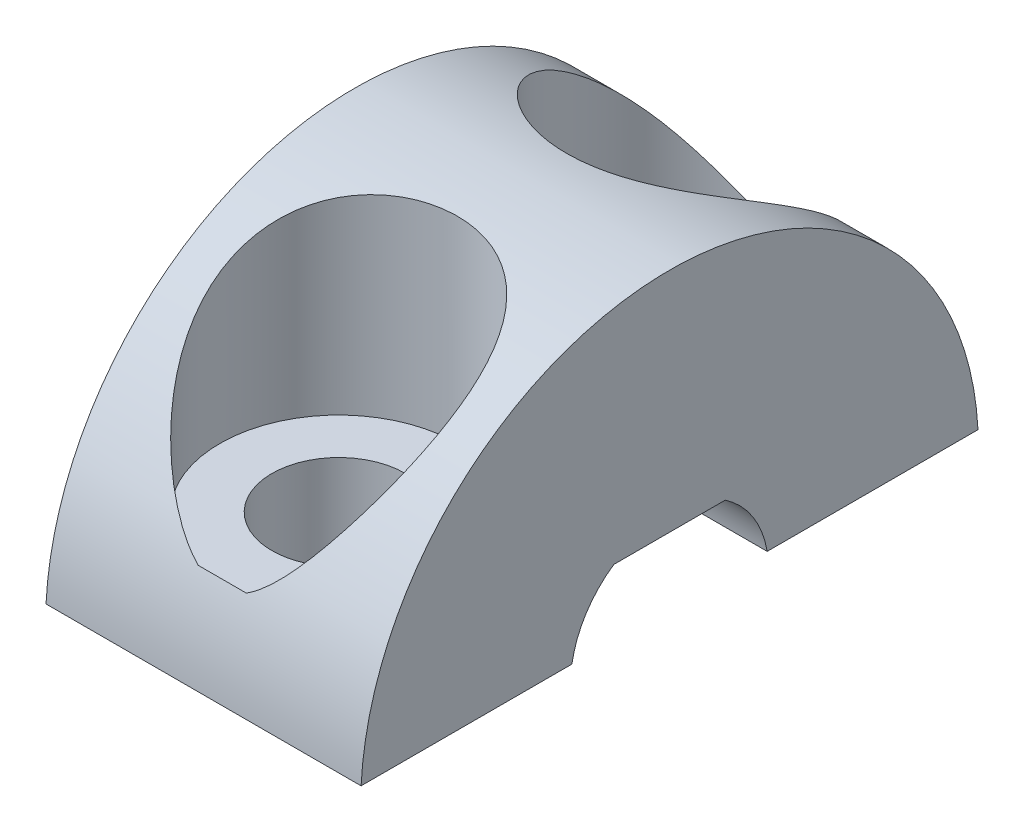
ISO-10303-21;
HEADER;
FILE_DESCRIPTION(('STEP AP214'),'2;1');
FILE_NAME('part.step','',(''),(''),'','','');
FILE_SCHEMA(('AUTOMOTIVE_DESIGN { 1 0 10303 214 1 1 1 1 }'));
ENDSEC;
DATA;
#1=APPLICATION_CONTEXT('core data for automotive mechanical design processes');
#2=APPLICATION_PROTOCOL_DEFINITION('international standard','automotive_design',2000,#1);
#3=PRODUCT_CONTEXT('',#1,'mechanical');
#4=PRODUCT('Part','Part','',(#3));
#5=PRODUCT_RELATED_PRODUCT_CATEGORY('part','',(#4));
#6=PRODUCT_DEFINITION_FORMATION('','',#4);
#7=PRODUCT_DEFINITION_CONTEXT('part definition',#1,'design');
#8=PRODUCT_DEFINITION('design','',#6,#7);
#9=PRODUCT_DEFINITION_SHAPE('','',#8);
#10=(LENGTH_UNIT() NAMED_UNIT(*) SI_UNIT(.MILLI.,.METRE.));
#11=(NAMED_UNIT(*) PLANE_ANGLE_UNIT() SI_UNIT($,.RADIAN.));
#12=(NAMED_UNIT(*) SI_UNIT($,.STERADIAN.) SOLID_ANGLE_UNIT());
#13=UNCERTAINTY_MEASURE_WITH_UNIT(LENGTH_MEASURE(1.E-05),#10,'distance_accuracy_value','');
#14=(GEOMETRIC_REPRESENTATION_CONTEXT(3) GLOBAL_UNCERTAINTY_ASSIGNED_CONTEXT((#13)) GLOBAL_UNIT_ASSIGNED_CONTEXT((#10,
#11,#12)) REPRESENTATION_CONTEXT('',''));
#15=CARTESIAN_POINT('',(0.,0.,0.));
#16=DIRECTION('',(0.,0.,1.));
#17=DIRECTION('',(1.,0.,0.));
#18=AXIS2_PLACEMENT_3D('',#15,#16,#17);
#19=CARTESIAN_POINT('',(-4.608292147038,9.363068992456,-5.25));
#20=DIRECTION('',(0.,-1.,0.));
#21=DIRECTION('',(0.,0.,-1.));
#22=AXIS2_PLACEMENT_3D('',#19,#20,#21);
#23=CYLINDRICAL_SURFACE('',#22,2.025);
#24=CARTESIAN_POINT('',(-4.608292147038,0.5,-5.25));
#25=DIRECTION('',(0.,-1.,0.));
#26=DIRECTION('',(0.,0.,-1.));
#27=AXIS2_PLACEMENT_3D('',#24,#25,#26);
#28=CIRCLE('',#27,2.025);
#29=CARTESIAN_POINT('',(-4.608292147038,0.5,-7.275));
#30=VERTEX_POINT('',#29);
#31=EDGE_CURVE('E102',#30,#30,#28,.T.);
#32=ORIENTED_EDGE('',*,*,#31,.T.);
#33=EDGE_LOOP('',(#32));
#34=FACE_BOUND('',#33,.T.);
#35=CARTESIAN_POINT('',(-4.608292147038,3.25,-5.25));
#36=DIRECTION('',(0.,-1.,0.));
#37=DIRECTION('',(0.,0.,-1.));
#38=AXIS2_PLACEMENT_3D('',#35,#36,#37);
#39=CIRCLE('',#38,2.025);
#40=CARTESIAN_POINT('',(-4.608292147038,3.25,-7.275));
#41=VERTEX_POINT('',#40);
#42=EDGE_CURVE('E20',#41,#41,#39,.F.);
#43=ORIENTED_EDGE('',*,*,#42,.T.);
#44=EDGE_LOOP('',(#43));
#45=FACE_BOUND('',#44,.T.);
#46=ADVANCED_FACE('F17',(#34,#45),#23,.F.);
#47=CARTESIAN_POINT('',(-4.608292147038,9.363068992456,5.25));
#48=DIRECTION('',(0.,-1.,0.));
#49=DIRECTION('',(0.,0.,-1.));
#50=AXIS2_PLACEMENT_3D('',#47,#48,#49);
#51=CYLINDRICAL_SURFACE('',#50,2.025);
#52=CARTESIAN_POINT('',(-4.608292147038,0.5,5.25));
#53=DIRECTION('',(0.,-1.,0.));
#54=DIRECTION('',(0.,0.,-1.));
#55=AXIS2_PLACEMENT_3D('',#52,#53,#54);
#56=CIRCLE('',#55,2.025);
#57=CARTESIAN_POINT('',(-4.608292147038,0.5,3.225));
#58=VERTEX_POINT('',#57);
#59=EDGE_CURVE('E125',#58,#58,#56,.T.);
#60=ORIENTED_EDGE('',*,*,#59,.T.);
#61=EDGE_LOOP('',(#60));
#62=FACE_BOUND('',#61,.T.);
#63=CARTESIAN_POINT('',(-4.608292147038,3.25,5.25));
#64=DIRECTION('',(0.,-1.,0.));
#65=DIRECTION('',(0.,0.,-1.));
#66=AXIS2_PLACEMENT_3D('',#63,#64,#65);
#67=CIRCLE('',#66,2.025);
#68=CARTESIAN_POINT('',(-4.608292147038,3.25,3.225));
#69=VERTEX_POINT('',#68);
#70=EDGE_CURVE('E108',#69,#69,#67,.F.);
#71=ORIENTED_EDGE('',*,*,#70,.T.);
#72=EDGE_LOOP('',(#71));
#73=FACE_BOUND('',#72,.T.);
#74=ADVANCED_FACE('F196',(#62,#73),#51,.F.);
#75=CARTESIAN_POINT('',(-9.3809,0.,0.));
#76=DIRECTION('',(1.,0.,0.));
#77=DIRECTION('',(0.,0.,-1.));
#78=AXIS2_PLACEMENT_3D('',#75,#76,#77);
#79=CYLINDRICAL_SURFACE('',#78,3.);
#80=CARTESIAN_POINT('',(-9.3809,0.,0.));
#81=DIRECTION('',(1.,0.,0.));
#82=DIRECTION('',(0.,0.,-1.));
#83=AXIS2_PLACEMENT_3D('',#80,#81,#82);
#84=CIRCLE('',#83,3.);
#85=CARTESIAN_POINT('',(-9.3809,0.5,-2.9580398915499));
#86=VERTEX_POINT('',#85);
#87=CARTESIAN_POINT('',(-9.3809,2.48,-1.68807582768087));
#88=VERTEX_POINT('',#87);
#89=EDGE_CURVE('E82',#86,#88,#84,.T.);
#90=ORIENTED_EDGE('',*,*,#89,.F.);
#91=DIRECTION('',(1.,0.,0.));
#92=VECTOR('',#91,1.);
#93=CARTESIAN_POINT('',(-30.06346923242,0.5,-2.95803989155));
#94=LINE('',#93,#92);
#95=CARTESIAN_POINT('',(0.164315705923301,0.5,-2.9580398915499));
#96=VERTEX_POINT('',#95);
#97=EDGE_CURVE('E73',#86,#96,#94,.T.);
#98=ORIENTED_EDGE('',*,*,#97,.T.);
#99=CARTESIAN_POINT('',(0.164315705923301,0.,0.));
#100=DIRECTION('',(1.,0.,0.));
#101=DIRECTION('',(0.,0.,-1.));
#102=AXIS2_PLACEMENT_3D('',#99,#100,#101);
#103=CIRCLE('',#102,3.);
#104=CARTESIAN_POINT('',(0.164315705923301,2.48,-1.68807582768087));
#105=VERTEX_POINT('',#104);
#106=EDGE_CURVE('E85',#96,#105,#103,.T.);
#107=ORIENTED_EDGE('',*,*,#106,.T.);
#108=DIRECTION('',(1.,0.,0.));
#109=VECTOR('',#108,1.);
#110=CARTESIAN_POINT('',(-30.06346923242,2.48,-1.688075827681));
#111=LINE('',#110,#109);
#112=EDGE_CURVE('E78',#105,#88,#111,.F.);
#113=ORIENTED_EDGE('',*,*,#112,.T.);
#114=EDGE_LOOP('',(#90,#98,#107,#113));
#115=FACE_BOUND('',#114,.T.);
#116=ADVANCED_FACE('F80',(#115),#79,.F.);
#117=CARTESIAN_POINT('',(-30.06346923242,2.48,0.));
#118=DIRECTION('',(0.,1.,0.));
#119=DIRECTION('',(0.,0.,1.));
#120=AXIS2_PLACEMENT_3D('',#117,#118,#119);
#121=PLANE('',#120);
#122=DIRECTION('',(0.,0.,1.));
#123=VECTOR('',#122,1.);
#124=CARTESIAN_POINT('',(0.1643157059233,2.48,-12.20818350622));
#125=LINE('',#124,#123);
#126=CARTESIAN_POINT('',(0.164315705923301,2.47999999999994,1.68807582768083));
#127=VERTEX_POINT('',#126);
#128=EDGE_CURVE('E172',#105,#127,#125,.T.);
#129=ORIENTED_EDGE('',*,*,#128,.T.);
#130=DIRECTION('',(1.,0.,0.));
#131=VECTOR('',#130,1.);
#132=CARTESIAN_POINT('',(-9.3809,2.47999999999988,1.68807582768092));
#133=LINE('',#132,#131);
#134=CARTESIAN_POINT('',(-9.3809,2.47999999999994,1.68807582768083));
#135=VERTEX_POINT('',#134);
#136=EDGE_CURVE('E88',#127,#135,#133,.F.);
#137=ORIENTED_EDGE('',*,*,#136,.T.);
#138=DIRECTION('',(0.,0.,1.));
#139=VECTOR('',#138,1.);
#140=CARTESIAN_POINT('',(-9.3809,2.48,0.));
#141=LINE('',#140,#139);
#142=EDGE_CURVE('E91',#88,#135,#141,.T.);
#143=ORIENTED_EDGE('',*,*,#142,.F.);
#144=ORIENTED_EDGE('',*,*,#112,.F.);
#145=EDGE_LOOP('',(#129,#137,#143,#144));
#146=FACE_BOUND('',#145,.T.);
#147=ADVANCED_FACE('F92',(#146),#121,.F.);
#148=CARTESIAN_POINT('',(-9.3809,0.,0.));
#149=DIRECTION('',(1.,0.,0.));
#150=DIRECTION('',(0.,0.,-1.));
#151=AXIS2_PLACEMENT_3D('',#148,#149,#150);
#152=CYLINDRICAL_SURFACE('',#151,3.);
#153=DIRECTION('',(1.,0.,0.));
#154=VECTOR('',#153,1.);
#155=CARTESIAN_POINT('',(-30.06346923242,0.5,2.95803989155));
#156=LINE('',#155,#154);
#157=CARTESIAN_POINT('',(0.164315705923301,0.5,2.9580398915499));
#158=VERTEX_POINT('',#157);
#159=CARTESIAN_POINT('',(-9.3809,0.5,2.9580398915499));
#160=VERTEX_POINT('',#159);
#161=EDGE_CURVE('E123',#158,#160,#156,.F.);
#162=ORIENTED_EDGE('',*,*,#161,.T.);
#163=CARTESIAN_POINT('',(-9.3809,0.,0.));
#164=DIRECTION('',(1.,0.,0.));
#165=DIRECTION('',(0.,0.,-1.));
#166=AXIS2_PLACEMENT_3D('',#163,#164,#165);
#167=CIRCLE('',#166,3.);
#168=EDGE_CURVE('E96',#135,#160,#167,.T.);
#169=ORIENTED_EDGE('',*,*,#168,.F.);
#170=ORIENTED_EDGE('',*,*,#136,.F.);
#171=CARTESIAN_POINT('',(0.164315705923301,0.,0.));
#172=DIRECTION('',(1.,0.,0.));
#173=DIRECTION('',(0.,0.,-1.));
#174=AXIS2_PLACEMENT_3D('',#171,#172,#173);
#175=CIRCLE('',#174,3.);
#176=EDGE_CURVE('E185',#127,#158,#175,.T.);
#177=ORIENTED_EDGE('',*,*,#176,.T.);
#178=EDGE_LOOP('',(#162,#169,#170,#177));
#179=FACE_BOUND('',#178,.T.);
#180=ADVANCED_FACE('F183',(#179),#152,.F.);
#181=CARTESIAN_POINT('',(-4.608292147038,3.25,-5.25));
#182=DIRECTION('',(0.,-1.,0.));
#183=DIRECTION('',(0.,0.,-1.));
#184=AXIS2_PLACEMENT_3D('',#181,#182,#183);
#185=PLANE('',#184);
#186=ORIENTED_EDGE('',*,*,#42,.F.);
#187=EDGE_LOOP('',(#186));
#188=FACE_BOUND('',#187,.T.);
#189=DIRECTION('',(1.,0.,0.));
#190=VECTOR('',#189,1.);
#191=CARTESIAN_POINT('',(-4.608292147038,3.25,-8.775697593423));
#192=LINE('',#191,#190);
#193=CARTESIAN_POINT('',(-5.33592974896016,3.25,-8.775697593423));
#194=VERTEX_POINT('',#193);
#195=CARTESIAN_POINT('',(-3.88065454511634,3.25,-8.775697593423));
#196=VERTEX_POINT('',#195);
#197=EDGE_CURVE('E116',#194,#196,#192,.T.);
#198=ORIENTED_EDGE('',*,*,#197,.F.);
#199=CARTESIAN_POINT('',(-4.608292147038,3.25,-5.25));
#200=DIRECTION('',(0.,-1.,0.));
#201=DIRECTION('',(0.,0.,-1.));
#202=AXIS2_PLACEMENT_3D('',#199,#200,#201);
#203=CIRCLE('',#202,3.6);
#204=EDGE_CURVE('E191',#194,#196,#203,.F.);
#205=ORIENTED_EDGE('',*,*,#204,.T.);
#206=EDGE_LOOP('',(#198,#205));
#207=FACE_BOUND('',#206,.T.);
#208=ADVANCED_FACE('F213',(#188,#207),#185,.F.);
#209=CARTESIAN_POINT('',(-4.608292147038,3.25,5.25));
#210=DIRECTION('',(0.,-1.,0.));
#211=DIRECTION('',(0.,0.,-1.));
#212=AXIS2_PLACEMENT_3D('',#209,#210,#211);
#213=PLANE('',#212);
#214=ORIENTED_EDGE('',*,*,#70,.F.);
#215=EDGE_LOOP('',(#214));
#216=FACE_BOUND('',#215,.T.);
#217=CARTESIAN_POINT('',(-4.608292147038,3.25,5.25));
#218=DIRECTION('',(0.,-1.,0.));
#219=DIRECTION('',(0.,0.,-1.));
#220=AXIS2_PLACEMENT_3D('',#217,#218,#219);
#221=CIRCLE('',#220,3.6);
#222=CARTESIAN_POINT('',(-3.88065454511634,3.25,8.775697593423));
#223=VERTEX_POINT('',#222);
#224=CARTESIAN_POINT('',(-5.33592974896016,3.25,8.775697593423));
#225=VERTEX_POINT('',#224);
#226=EDGE_CURVE('E168',#223,#225,#221,.F.);
#227=ORIENTED_EDGE('',*,*,#226,.T.);
#228=DIRECTION('',(1.,0.,0.));
#229=VECTOR('',#228,1.);
#230=CARTESIAN_POINT('',(-4.608292147038,3.25,8.775697593423));
#231=LINE('',#230,#229);
#232=EDGE_CURVE('E110',#223,#225,#231,.F.);
#233=ORIENTED_EDGE('',*,*,#232,.F.);
#234=EDGE_LOOP('',(#227,#233));
#235=FACE_BOUND('',#234,.T.);
#236=ADVANCED_FACE('F209',(#216,#235),#213,.F.);
#237=CARTESIAN_POINT('',(-30.06346923242,0.5,0.));
#238=DIRECTION('',(0.,1.,0.));
#239=DIRECTION('',(0.,0.,1.));
#240=AXIS2_PLACEMENT_3D('',#237,#238,#239);
#241=PLANE('',#240);
#242=ORIENTED_EDGE('',*,*,#31,.F.);
#243=EDGE_LOOP('',(#242));
#244=FACE_BOUND('',#243,.T.);
#245=DIRECTION('',(0.,0.,1.));
#246=VECTOR('',#245,1.);
#247=CARTESIAN_POINT('',(0.1643157059233,0.5,-12.20818350622));
#248=LINE('',#247,#246);
#249=CARTESIAN_POINT('',(0.164315705923301,0.500000000000016,-9.3448043452616));
#250=VERTEX_POINT('',#249);
#251=EDGE_CURVE('E166',#250,#96,#248,.T.);
#252=ORIENTED_EDGE('',*,*,#251,.T.);
#253=ORIENTED_EDGE('',*,*,#97,.F.);
#254=DIRECTION('',(0.,0.,1.));
#255=VECTOR('',#254,1.);
#256=CARTESIAN_POINT('',(-9.3809,0.5,0.));
#257=LINE('',#256,#255);
#258=CARTESIAN_POINT('',(-9.3809,0.500000000000016,-9.3448043452616));
#259=VERTEX_POINT('',#258);
#260=EDGE_CURVE('E100',#259,#86,#257,.T.);
#261=ORIENTED_EDGE('',*,*,#260,.F.);
#262=DIRECTION('',(1.,0.,0.));
#263=VECTOR('',#262,1.);
#264=CARTESIAN_POINT('',(-9.3809,0.500000000000032,-9.3448043452616));
#265=LINE('',#264,#263);
#266=EDGE_CURVE('E119',#250,#259,#265,.F.);
#267=ORIENTED_EDGE('',*,*,#266,.F.);
#268=EDGE_LOOP('',(#252,#253,#261,#267));
#269=FACE_BOUND('',#268,.T.);
#270=ADVANCED_FACE('F165',(#244,#269),#241,.F.);
#271=CARTESIAN_POINT('',(-9.3809,0.,0.));
#272=DIRECTION('',(-1.,0.,0.));
#273=DIRECTION('',(0.,0.,1.));
#274=AXIS2_PLACEMENT_3D('',#271,#272,#273);
#275=PLANE('',#274);
#276=ORIENTED_EDGE('',*,*,#168,.T.);
#277=DIRECTION('',(0.,0.,1.));
#278=VECTOR('',#277,1.);
#279=CARTESIAN_POINT('',(-9.3809,0.5,0.));
#280=LINE('',#279,#278);
#281=CARTESIAN_POINT('',(-9.3809,0.500000000000017,9.3448043452616));
#282=VERTEX_POINT('',#281);
#283=EDGE_CURVE('E126',#160,#282,#280,.T.);
#284=ORIENTED_EDGE('',*,*,#283,.T.);
#285=CARTESIAN_POINT('',(-9.3809,0.,0.));
#286=DIRECTION('',(1.,0.,0.));
#287=DIRECTION('',(0.,0.,-1.));
#288=AXIS2_PLACEMENT_3D('',#285,#286,#287);
#289=CIRCLE('',#288,9.358171202282);
#290=EDGE_CURVE('E167',#259,#282,#289,.T.);
#291=ORIENTED_EDGE('',*,*,#290,.F.);
#292=ORIENTED_EDGE('',*,*,#260,.T.);
#293=ORIENTED_EDGE('',*,*,#89,.T.);
#294=ORIENTED_EDGE('',*,*,#142,.T.);
#295=EDGE_LOOP('',(#276,#284,#291,#292,#293,#294));
#296=FACE_BOUND('',#295,.T.);
#297=ADVANCED_FACE('F98',(#296),#275,.T.);
#298=CARTESIAN_POINT('',(-30.06346923242,0.5,0.));
#299=DIRECTION('',(0.,1.,0.));
#300=DIRECTION('',(0.,0.,1.));
#301=AXIS2_PLACEMENT_3D('',#298,#299,#300);
#302=PLANE('',#301);
#303=ORIENTED_EDGE('',*,*,#59,.F.);
#304=EDGE_LOOP('',(#303));
#305=FACE_BOUND('',#304,.T.);
#306=DIRECTION('',(0.,0.,1.));
#307=VECTOR('',#306,1.);
#308=CARTESIAN_POINT('',(0.1643157059233,0.5,-12.20818350622));
#309=LINE('',#308,#307);
#310=CARTESIAN_POINT('',(0.164315705923301,0.500000000000017,9.3448043452616));
#311=VERTEX_POINT('',#310);
#312=EDGE_CURVE('E170',#158,#311,#309,.T.);
#313=ORIENTED_EDGE('',*,*,#312,.T.);
#314=DIRECTION('',(1.,0.,0.));
#315=VECTOR('',#314,1.);
#316=CARTESIAN_POINT('',(-9.3809,0.500000000000033,9.3448043452616));
#317=LINE('',#316,#315);
#318=EDGE_CURVE('E161',#282,#311,#317,.T.);
#319=ORIENTED_EDGE('',*,*,#318,.F.);
#320=ORIENTED_EDGE('',*,*,#283,.F.);
#321=ORIENTED_EDGE('',*,*,#161,.F.);
#322=EDGE_LOOP('',(#313,#319,#320,#321));
#323=FACE_BOUND('',#322,.T.);
#324=ADVANCED_FACE('F187',(#305,#323),#302,.F.);
#325=CARTESIAN_POINT('',(0.1643157059233,0.,-12.20818350622));
#326=DIRECTION('',(-1.,0.,0.));
#327=DIRECTION('',(0.,0.,1.));
#328=AXIS2_PLACEMENT_3D('',#325,#326,#327);
#329=PLANE('',#328);
#330=ORIENTED_EDGE('',*,*,#128,.F.);
#331=ORIENTED_EDGE('',*,*,#106,.F.);
#332=ORIENTED_EDGE('',*,*,#251,.F.);
#333=CARTESIAN_POINT('',(0.164315705923301,0.,0.));
#334=DIRECTION('',(1.,0.,0.));
#335=DIRECTION('',(0.,0.,-1.));
#336=AXIS2_PLACEMENT_3D('',#333,#334,#335);
#337=CIRCLE('',#336,9.358171202282);
#338=EDGE_CURVE('E157',#311,#250,#337,.F.);
#339=ORIENTED_EDGE('',*,*,#338,.F.);
#340=ORIENTED_EDGE('',*,*,#312,.F.);
#341=ORIENTED_EDGE('',*,*,#176,.F.);
#342=EDGE_LOOP('',(#330,#331,#332,#339,#340,#341));
#343=FACE_BOUND('',#342,.T.);
#344=ADVANCED_FACE('F169',(#343),#329,.F.);
#345=CARTESIAN_POINT('',(-4.608292147038,9.363068992456,-5.25));
#346=DIRECTION('',(0.,-1.,0.));
#347=DIRECTION('',(0.,0.,-1.));
#348=AXIS2_PLACEMENT_3D('',#345,#346,#347);
#349=CYLINDRICAL_SURFACE('',#348,3.6);
#350=CARTESIAN_POINT('',(-3.88065454511728,3.25000000000063,-8.77569759342333));
#351=CARTESIAN_POINT('',(-3.82822222086699,3.27925993003872,-8.76486619239412));
#352=CARTESIAN_POINT('',(-3.7771693134892,3.31051487389945,-8.75312060992005));
#353=CARTESIAN_POINT('',(-3.67764572186219,3.37615729280703,-8.72800888504184));
#354=CARTESIAN_POINT('',(-3.62917105251312,3.410539696851,-8.71464535479945));
#355=CARTESIAN_POINT('',(-3.53470342159371,3.48149648326168,-8.68654168119276));
#356=CARTESIAN_POINT('',(-3.48869906199503,3.51805878950824,-8.67180890777372));
#357=CARTESIAN_POINT('',(-3.39864429564441,3.59301925272248,-8.64101992219241));
#358=CARTESIAN_POINT('',(-3.35459479214836,3.63141824166235,-8.62496310784175));
#359=CARTESIAN_POINT('',(-3.22558741311933,3.74824165383154,-8.57514829008316));
#360=CARTESIAN_POINT('',(-3.14320052832104,3.82873618691578,-8.53957217479497));
#361=CARTESIAN_POINT('',(-2.98394284957783,3.99321194743316,-8.46391571841471));
#362=CARTESIAN_POINT('',(-2.90708205818085,4.07719908363456,-8.42382753065622));
#363=CARTESIAN_POINT('',(-2.70538831333384,4.30745673557805,-8.30947695660882));
#364=CARTESIAN_POINT('',(-2.58512697192804,4.45571638027156,-8.23111710450224));
#365=CARTESIAN_POINT('',(-2.35641980579885,4.75433163386516,-8.0623321492388));
#366=CARTESIAN_POINT('',(-2.24797303257545,4.90468707341538,-7.97190801592805));
#367=CARTESIAN_POINT('',(-2.04173759302878,5.20613509809918,-7.77841734438511));
#368=CARTESIAN_POINT('',(-1.94401038196338,5.35722722349332,-7.67528444574817));
#369=CARTESIAN_POINT('',(-1.76030488156759,5.65757159534017,-7.45665792763854));
#370=CARTESIAN_POINT('',(-1.67432354528804,5.80682430977229,-7.34116752768966));
#371=CARTESIAN_POINT('',(-1.53175615275649,6.07132539949251,-7.12301602645322));
#372=CARTESIAN_POINT('',(-1.47277387275421,6.18719781054039,-7.02267246542643));
#373=CARTESIAN_POINT('',(-1.36373690815469,6.41608212390434,-6.81419162671771));
#374=CARTESIAN_POINT('',(-1.31368011783212,6.52909469550824,-6.70605619578998));
#375=CARTESIAN_POINT('',(-1.22370482967739,6.75110281640984,-6.48249290255417));
#376=CARTESIAN_POINT('',(-1.18375288993677,6.86011056787856,-6.36709071647581));
#377=CARTESIAN_POINT('',(-1.11505840503387,7.07362361337545,-6.12900966657226));
#378=CARTESIAN_POINT('',(-1.08631273597752,7.17813015493837,-6.00633284164947));
#379=CARTESIAN_POINT('',(-1.04681559745504,7.35752843247012,-5.78423850366234));
#380=CARTESIAN_POINT('',(-1.03341269930387,7.43356235451041,-5.68621053686555));
#381=CARTESIAN_POINT('',(-1.01468651817914,7.58200707623286,-5.48670974748002));
#382=CARTESIAN_POINT('',(-1.00936131257074,7.65441873410926,-5.38523775051236));
#383=CARTESIAN_POINT('',(-1.00751338630599,7.7951539636482,-5.17942866457234));
#384=CARTESIAN_POINT('',(-1.01098914970813,7.86347823727579,-5.07509207208039));
#385=CARTESIAN_POINT('',(-1.02745298517336,7.9955838414957,-4.86430544432806));
#386=CARTESIAN_POINT('',(-1.04043973752809,8.05936580101501,-4.75785570427341));
#387=CARTESIAN_POINT('',(-1.0738598500825,8.17276710811216,-4.559851773434));
#388=CARTESIAN_POINT('',(-1.0928865691642,8.2230768690982,-4.46845454011333));
#389=CARTESIAN_POINT('',(-1.13860580032102,8.31986212895082,-4.28555267449863));
#390=CARTESIAN_POINT('',(-1.16529703573472,8.36633826471759,-4.1940480626163));
#391=CARTESIAN_POINT('',(-1.226582651955,8.45527017370032,-4.01174029474278));
#392=CARTESIAN_POINT('',(-1.26117609434645,8.49772642344588,-3.92093705678356));
#393=CARTESIAN_POINT('',(-1.33837500386715,8.57848286280573,-3.74095235898971));
#394=CARTESIAN_POINT('',(-1.38097669580244,8.61678499736221,-3.65177015661478));
#395=CARTESIAN_POINT('',(-1.47440850076562,8.68937443938358,-3.47552377250443));
#396=CARTESIAN_POINT('',(-1.52527533585808,8.72364259474669,-3.38847113564536));
#397=CARTESIAN_POINT('',(-1.63492335663307,8.78798425821772,-3.21791955585625));
#398=CARTESIAN_POINT('',(-1.69370136956069,8.81805943811282,-3.13441920586937));
#399=CARTESIAN_POINT('',(-1.81890567017453,8.87416015635134,-2.97187581056429));
#400=CARTESIAN_POINT('',(-1.8853338178399,8.90018470623211,-2.89283385620556));
#401=CARTESIAN_POINT('',(-2.02539513357154,8.94837341905239,-2.74014456146382));
#402=CARTESIAN_POINT('',(-2.09902789328944,8.97053780058369,-2.66649691575141));
#403=CARTESIAN_POINT('',(-2.24733779541843,9.00978274937285,-2.53057669131279));
#404=CARTESIAN_POINT('',(-2.32154766867177,9.02711610761031,-2.46786627379847));
#405=CARTESIAN_POINT('',(-2.47520892136104,9.05893656600153,-2.34837413696028));
#406=CARTESIAN_POINT('',(-2.55466202965728,9.07342272101528,-2.29159438926587));
#407=CARTESIAN_POINT('',(-2.71819528888755,9.09979215797165,-2.1845349656143));
#408=CARTESIAN_POINT('',(-2.8022733080874,9.11167662672254,-2.13425233018424));
#409=CARTESIAN_POINT('',(-2.97448664882208,9.13310775825977,-2.0405908699461));
#410=CARTESIAN_POINT('',(-3.06262347213872,9.1426535473289,-1.99721462743889));
#411=CARTESIAN_POINT('',(-3.33094746518793,9.16803299501716,-1.87859643500304));
#412=CARTESIAN_POINT('',(-3.51630651161772,9.18080091830685,-1.81404173334415));
#413=CARTESIAN_POINT('',(-3.8952663003836,9.19965327885973,-1.71588412375346));
#414=CARTESIAN_POINT('',(-4.08886751783308,9.2057373302931,-1.68228300265055));
#415=CARTESIAN_POINT('',(-4.48154948917165,9.21215820620745,-1.64677052851197));
#416=CARTESIAN_POINT('',(-4.6806685709422,9.21242143252756,-1.64526499872719));
#417=CARTESIAN_POINT('',(-5.07636165009233,9.20705197285929,-1.67504711103654));
#418=CARTESIAN_POINT('',(-5.27293551535658,9.20141898204633,-1.70633644857059));
#419=CARTESIAN_POINT('',(-5.65867900009237,9.18337718592976,-1.80090502651206));
#420=CARTESIAN_POINT('',(-5.84781920894351,9.17094390214016,-1.86429977284107));
#421=CARTESIAN_POINT('',(-6.21244715958778,9.1376731010653,-2.02105947642638));
#422=CARTESIAN_POINT('',(-6.38793602603245,9.11683627697346,-2.11442196156644));
#423=CARTESIAN_POINT('',(-6.71880306230336,9.06489872813692,-2.32697272853236));
#424=CARTESIAN_POINT('',(-6.87433156433647,9.03388186354991,-2.44594735784311));
#425=CARTESIAN_POINT('',(-7.16252154051069,8.95950943057658,-2.70568760255561));
#426=CARTESIAN_POINT('',(-7.29518748990084,8.91615628138126,-2.84644894303688));
#427=CARTESIAN_POINT('',(-7.53305029049685,8.81612106469541,-3.14252571300668));
#428=CARTESIAN_POINT('',(-7.63854137703163,8.75959560281408,-3.29765814581848));
#429=CARTESIAN_POINT('',(-7.8223259966211,8.63229588657538,-3.61780159893929));
#430=CARTESIAN_POINT('',(-7.90061892699132,8.56152131652664,-3.782812838058));
#431=CARTESIAN_POINT('',(-8.03169425049134,8.40396274590966,-4.12122703439063));
#432=CARTESIAN_POINT('',(-8.08374529096651,8.31680405545533,-4.29473648888667));
#433=CARTESIAN_POINT('',(-8.16073029051231,8.12900095365214,-4.64041715646911));
#434=CARTESIAN_POINT('',(-8.18565140935339,8.02835018196945,-4.81258769762631));
#435=CARTESIAN_POINT('',(-8.21239255439568,7.80315191781765,-5.1706750471417));
#436=CARTESIAN_POINT('',(-8.21124400835015,7.67718790376513,-5.35591147725251));
#437=CARTESIAN_POINT('',(-8.18263279457279,7.41340761001181,-5.71546603801764));
#438=CARTESIAN_POINT('',(-8.15516284500952,7.27558806007419,-5.88978113306039));
#439=CARTESIAN_POINT('',(-8.08657945283089,7.02255541323034,-6.18775779136301));
#440=CARTESIAN_POINT('',(-8.0498815628734,6.90916521861335,-6.3140392423229));
#441=CARTESIAN_POINT('',(-7.96466678361923,6.67781496993423,-6.55823492957662));
#442=CARTESIAN_POINT('',(-7.91614465419146,6.55985290931024,-6.67614542612687));
#443=CARTESIAN_POINT('',(-7.80848622202171,6.31996819212267,-6.90368085538635));
#444=CARTESIAN_POINT('',(-7.74931198529061,6.19803269968901,-7.01327411868369));
#445=CARTESIAN_POINT('',(-7.62158354467208,5.95153646957223,-7.2236301096558));
#446=CARTESIAN_POINT('',(-7.5530301196142,5.82697595059197,-7.32439356940175));
#447=CARTESIAN_POINT('',(-7.40551691560738,5.57296852622583,-7.51955316325911));
#448=CARTESIAN_POINT('',(-7.32633951622246,5.44347737088416,-7.61372663412986));
#449=CARTESIAN_POINT('',(-7.15946601697039,5.18367256561908,-7.79293287520605));
#450=CARTESIAN_POINT('',(-7.07176997882757,5.05335892166164,-7.87796571163327));
#451=CARTESIAN_POINT('',(-6.88842011115647,4.7938380583201,-8.03850956941587));
#452=CARTESIAN_POINT('',(-6.79281352741309,4.66462872691612,-8.1140711811197));
#453=CARTESIAN_POINT('',(-6.59263787686164,4.40809977422094,-8.25623946114421));
#454=CARTESIAN_POINT('',(-6.48806614548446,4.28078072803223,-8.3228434519184));
#455=CARTESIAN_POINT('',(-6.30424305101168,4.0713880192793,-8.42662782331602));
#456=CARTESIAN_POINT('',(-6.22782407087012,3.98807185824801,-8.46633058640738));
#457=CARTESIAN_POINT('',(-6.06950809724512,3.82490857289602,-8.54127976620887));
#458=CARTESIAN_POINT('',(-5.98762039082097,3.74505592904288,-8.57653345820452));
#459=CARTESIAN_POINT('',(-5.8593464286393,3.62909213985407,-8.62594075869209));
#460=CARTESIAN_POINT('',(-5.81549840900244,3.59093122414073,-8.64188665117698));
#461=CARTESIAN_POINT('',(-5.72586377546606,3.51643472783043,-8.67246641911265));
#462=CARTESIAN_POINT('',(-5.68007804336022,3.48009833306497,-8.68710088210092));
#463=CARTESIAN_POINT('',(-5.58607635864443,3.40958144736585,-8.71501926153564));
#464=CARTESIAN_POINT('',(-5.53784942411475,3.37541261303198,-8.72829607800398));
#465=CARTESIAN_POINT('',(-5.43884885516856,3.31016792143175,-8.75325093589596));
#466=CARTESIAN_POINT('',(-5.38807132626035,3.27909702447062,-8.76492642420927));
#467=CARTESIAN_POINT('',(-5.33592974896044,3.25000000000039,-8.77569759342361));
#468=B_SPLINE_CURVE_WITH_KNOTS('',3,(#350,#351,#352,#353,#354,#355,#356,#357,#358,#359,#360,
#361,#362,#363,#364,#365,#366,#367,#368,#369,#370,#371,#372,#373,#374,#375,#376,#377,#378,#379,
#380,#381,#382,#383,#384,#385,#386,#387,#388,#389,#390,#391,#392,#393,#394,#395,#396,#397,#398,
#399,#400,#401,#402,#403,#404,#405,#406,#407,#408,#409,#410,#411,#412,#413,#414,#415,#416,#417,
#418,#419,#420,#421,#422,#423,#424,#425,#426,#427,#428,#429,#430,#431,#432,#433,#434,#435,#436,
#437,#438,#439,#440,#441,#442,#443,#444,#445,#446,#447,#448,#449,#450,#451,#452,#453,#454,#455,
#456,#457,#458,#459,#460,#461,#462,#463,#464,#465,#466,#467),.UNSPECIFIED.,.F.,.F.,(4,2,2,2,2,2,
2,2,2,2,2,2,2,2,2,2,2,2,2,2,2,2,2,2,2,2,2,2,2,2,2,2,2,2,2,2,2,2,2,2,2,2,2,2,2,2,2,2,2,2,2,2,2,2,
2,2,2,2,4),(0.,0.182888887910945,0.365486345176787,0.54715235833207,0.728901455789584,
1.09017848358174,1.45209378708203,2.07029479942354,2.68844614457159,3.30997411095074,
3.9313405419097,4.42364895764805,4.91584107255106,5.40638231584695,5.89678671642584,
6.27080566050541,6.64473556743241,7.01860107039427,7.39241470703836,7.71024042444397,
8.0280132330056,8.34574832451861,8.66333400546914,8.98237137353473,9.30128117173204,
9.62026867089423,9.93923810070664,10.2349595609241,10.530779021829,10.8264632566067,
11.1222577894304,11.709356137354,12.2964883740412,12.891040088248,13.4856225413023,
14.0823594887674,14.6790472225049,15.2709380670314,15.8627129194738,16.4477819799967,
17.0328640042498,17.6334574524117,18.2343350300166,18.9039458175831,19.5737419068611,
20.0939924446968,20.6144739618469,21.1368470541181,21.6591767958421,22.1945878048228,
22.7299949346135,23.262407856913,23.7949795721467,24.1542644619362,24.5129540059123,
24.6937235780097,24.8744117538073,25.0560011230693,25.2378767285586),.UNSPECIFIED.);
#469=EDGE_CURVE('E26',#196,#194,#468,.T.);
#470=ORIENTED_EDGE('',*,*,#469,.F.);
#471=ORIENTED_EDGE('',*,*,#204,.F.);
#472=EDGE_LOOP('',(#470,#471));
#473=FACE_BOUND('',#472,.T.);
#474=ADVANCED_FACE('F148',(#473),#349,.F.);
#475=CARTESIAN_POINT('',(-4.608292147038,9.363068992456,5.25));
#476=DIRECTION('',(0.,-1.,0.));
#477=DIRECTION('',(0.,0.,-1.));
#478=AXIS2_PLACEMENT_3D('',#475,#476,#477);
#479=CYLINDRICAL_SURFACE('',#478,3.6);
#480=ORIENTED_EDGE('',*,*,#226,.F.);
#481=CARTESIAN_POINT('',(-5.33592974895946,3.25000000000104,8.77569759342318));
#482=CARTESIAN_POINT('',(-5.38836209031036,3.27925993962215,8.76486618885103));
#483=CARTESIAN_POINT('',(-5.43941501388379,3.31051489431153,8.75312060225247));
#484=CARTESIAN_POINT('',(-5.53893863628042,3.37615733663112,8.72800886813858));
#485=CARTESIAN_POINT('',(-5.58741332020814,3.41053975325276,8.71464533278808));
#486=CARTESIAN_POINT('',(-5.68188097887722,3.48149656582352,8.68654164816524));
#487=CARTESIAN_POINT('',(-5.72788535165573,3.51805888564448,8.67180886884391));
#488=CARTESIAN_POINT('',(-5.8179401433318,3.59301937672885,8.64101987070075));
#489=CARTESIAN_POINT('',(-5.86198965897269,3.63141837996506,8.62496304968998));
#490=CARTESIAN_POINT('',(-5.99099701712056,3.74824178496561,8.57514823254014));
#491=CARTESIAN_POINT('',(-6.07338387205652,3.82873629365028,8.53957212664792));
#492=CARTESIAN_POINT('',(-6.23264149493153,3.99321200255223,8.46391569210583));
#493=CARTESIAN_POINT('',(-6.30950226033888,4.07719911152772,8.42382751680191));
#494=CARTESIAN_POINT('',(-6.5111959403441,4.30745668947981,8.30947697950556));
#495=CARTESIAN_POINT('',(-6.63145724571663,4.45571628619496,8.23111715424605));
#496=CARTESIAN_POINT('',(-6.86016434686513,4.75433144356238,8.06233226024351));
#497=CARTESIAN_POINT('',(-6.96861109113254,4.90468683486623,7.97190816133778));
#498=CARTESIAN_POINT('',(-7.1748465450792,5.2061348596013,7.77841750521963));
#499=CARTESIAN_POINT('',(-7.27257379237458,5.35722703324676,7.67528457990758));
#500=CARTESIAN_POINT('',(-7.45627935819108,5.6575715010274,7.45665800061471));
#501=CARTESIAN_POINT('',(-7.54226072365347,5.80682426314067,7.34116756614941));
#502=CARTESIAN_POINT('',(-7.68482817666706,6.07132546507206,7.12301597236578));
#503=CARTESIAN_POINT('',(-7.74381048749642,6.18719794052468,7.02267235286286));
#504=CARTESIAN_POINT('',(-7.85284750320784,6.41608237903061,6.81419138850409));
#505=CARTESIAN_POINT('',(-7.90290431382359,6.52909501137447,6.7060558904097));
#506=CARTESIAN_POINT('',(-7.9928795795524,6.75110312406653,6.48249258008554));
#507=CARTESIAN_POINT('',(-8.03283148774924,6.86011081066517,6.36709045266102));
#508=CARTESIAN_POINT('',(-8.10152592137784,7.07362373095637,6.12900952856044));
#509=CARTESIAN_POINT('',(-8.13027157070058,7.17813021218249,6.00633277078453));
#510=CARTESIAN_POINT('',(-8.16976869492237,7.35752842475148,5.78423851321566));
#511=CARTESIAN_POINT('',(-8.18317159210922,7.43356233940101,5.68621055634632));
#512=CARTESIAN_POINT('',(-8.20189777297869,7.58200704710315,5.48670978745331));
#513=CARTESIAN_POINT('',(-8.20722297929538,7.65441869834965,5.38523780105044));
#514=CARTESIAN_POINT('',(-8.20907090906495,7.79515392975558,5.17942871589236));
#515=CARTESIAN_POINT('',(-8.20559514667933,7.8634782110558,5.07509211303464));
#516=CARTESIAN_POINT('',(-8.18913131137572,7.99558382932028,4.86430546463661));
#517=CARTESIAN_POINT('',(-8.17614455823684,8.05936579524521,4.75785571431789));
#518=CARTESIAN_POINT('',(-8.14272454255065,8.17276677372058,4.55985235732256));
#519=CARTESIAN_POINT('',(-8.12369796915477,8.22307622330812,4.46845571338125));
#520=CARTESIAN_POINT('',(-8.07797912981193,8.31986091113037,4.28555502299928));
#521=CARTESIAN_POINT('',(-8.05128814046544,8.36633678623482,4.19405099697011));
#522=CARTESIAN_POINT('',(-7.99000272689548,8.45526879789152,4.01174321146586));
#523=CARTESIAN_POINT('',(-7.95540913977328,8.49772535952575,3.92093937887355));
#524=CARTESIAN_POINT('',(-7.87820983802032,8.57848237026024,3.74095350582538));
#525=CARTESIAN_POINT('',(-7.83560789847674,8.61678476424787,3.6517707228524));
#526=CARTESIAN_POINT('',(-7.74217349608337,8.68937622403375,3.47551943915339));
#527=CARTESIAN_POINT('',(-7.69130396591862,8.72364595767791,3.38846259182522));
#528=CARTESIAN_POINT('',(-7.58164979244689,8.78799036477993,3.2179029987398));
#529=CARTESIAN_POINT('',(-7.52286832351594,8.81806671087911,3.13439884518707));
#530=CARTESIAN_POINT('',(-7.39766247009799,8.87416666359128,2.97185624521057));
#531=CARTESIAN_POINT('',(-7.33123696425414,8.90018967427117,2.89281845653112));
#532=CARTESIAN_POINT('',(-7.19118177703657,8.94837564013812,2.74013718175256));
#533=CARTESIAN_POINT('',(-7.11755251983126,8.97053882238469,2.66649337849291));
#534=CARTESIAN_POINT('',(-6.96926499211617,9.00977786051498,2.53059362178297));
#535=CARTESIAN_POINT('',(-6.8950751313311,9.02710712825854,2.46789875385691));
#536=CARTESIAN_POINT('',(-6.74145568296025,9.05892094034757,2.34843405321092));
#537=CARTESIAN_POINT('',(-6.66202432936777,9.07340451929518,2.29166623428809));
#538=CARTESIAN_POINT('',(-6.49849485752716,9.09977682997063,2.18459924624314));
#539=CARTESIAN_POINT('',(-6.41439644005538,9.1116653950804,2.13430049256548));
#540=CARTESIAN_POINT('',(-6.24213910799257,9.13310319559668,2.04061173093372));
#541=CARTESIAN_POINT('',(-6.15397880754029,9.14265162545217,1.99722410380933));
#542=CARTESIAN_POINT('',(-5.88544512790078,9.16805156551739,1.87850865919154));
#543=CARTESIAN_POINT('',(-5.69990392898847,9.18082803590948,1.8138987640691));
#544=CARTESIAN_POINT('',(-5.32084413017652,9.19966830664282,1.7158076065834));
#545=CARTESIAN_POINT('',(-5.12734371295393,9.20574661181559,1.68225910627632));
#546=CARTESIAN_POINT('',(-4.87869459755948,9.20980829547397,1.65975977951922));
#547=CARTESIAN_POINT('',(-4.82468598937853,9.21046690078989,1.65610216564886));
#548=CARTESIAN_POINT('',(-4.71655601803623,9.21134314224554,1.65122118589978));
#549=CARTESIAN_POINT('',(-4.6624346544524,9.21156077673008,1.64999782915819));
#550=CARTESIAN_POINT('',(-4.41032359392341,9.2115648985254,1.65000793754174));
#551=CARTESIAN_POINT('',(-4.21207235802545,9.20867030185646,1.66640058584222));
#552=CARTESIAN_POINT('',(-3.82084486282321,9.19663659115327,1.73156218934037));
#553=CARTESIAN_POINT('',(-3.62788150820393,9.18748340893599,1.78040407760886));
#554=CARTESIAN_POINT('',(-3.25309887031119,9.1616356469521,1.90894585133644));
#555=CARTESIAN_POINT('',(-3.07127468212023,9.1449444139233,1.98863204032579));
#556=CARTESIAN_POINT('',(-2.72410384406991,9.10214585427286,2.17612123137934));
#557=CARTESIAN_POINT('',(-2.55874697915069,9.0760444120424,2.28390665079791));
#558=CARTESIAN_POINT('',(-2.25040386492465,9.01256645080191,2.52271710647554));
#559=CARTESIAN_POINT('',(-2.10724729314917,8.9752829543386,2.6535468686771));
#560=CARTESIAN_POINT('',(-1.84551590109454,8.8875495063593,2.93400084866114));
#561=CARTESIAN_POINT('',(-1.72693947462371,8.83710041563714,3.08362383737193));
#562=CARTESIAN_POINT('',(-1.51752530908612,8.72230308485974,3.39471109195663));
#563=CARTESIAN_POINT('',(-1.42650899197907,8.6580491484987,3.55609033512251));
#564=CARTESIAN_POINT('',(-1.27193937664507,8.51531074530154,3.88549437444225));
#565=CARTESIAN_POINT('',(-1.20838858993462,8.4368249780025,4.05351977680468));
#566=CARTESIAN_POINT('',(-1.10562377030574,8.26246658019383,4.39841554750969));
#567=CARTESIAN_POINT('',(-1.06767199955219,8.16595744251764,4.57533541275473));
#568=CARTESIAN_POINT('',(-1.01861494962011,7.9598181351148,4.92523483669943));
#569=CARTESIAN_POINT('',(-1.00752712540827,7.85017948294635,5.09821176120133));
#570=CARTESIAN_POINT('',(-1.00890562991433,7.65340806695988,5.38719288116607));
#571=CARTESIAN_POINT('',(-1.0154648890565,7.56899047979546,5.50514934467923));
#572=CARTESIAN_POINT('',(-1.03940354767734,7.39530349726106,5.73635316889113));
#573=CARTESIAN_POINT('',(-1.05678653932809,7.30603250012581,5.84959895289677));
#574=CARTESIAN_POINT('',(-1.10130096225295,7.12327128114197,6.07083163701058));
#575=CARTESIAN_POINT('',(-1.12844391187012,7.02977618864561,6.17881215152765));
#576=CARTESIAN_POINT('',(-1.19146674922091,6.83930067066477,6.38901105219503));
#577=CARTESIAN_POINT('',(-1.22734888883474,6.74231935236238,6.49122794482413));
#578=CARTESIAN_POINT('',(-1.32028292447943,6.51253370022833,6.72287528832847));
#579=CARTESIAN_POINT('',(-1.38040076342895,6.37860273312657,6.84996465720681));
#580=CARTESIAN_POINT('',(-1.51287097359181,6.10691984000837,7.09324871343907));
#581=CARTESIAN_POINT('',(-1.58522828627423,5.96916638958533,7.20943897090034));
#582=CARTESIAN_POINT('',(-1.74108452512166,5.69075781070338,7.43117716547334));
#583=CARTESIAN_POINT('',(-1.82461163668024,5.55009612880046,7.53669695375473));
#584=CARTESIAN_POINT('',(-2.00185017273845,5.26751836505829,7.73683209777154));
#585=CARTESIAN_POINT('',(-2.09555865251682,5.12560265676812,7.83145059022372));
#586=CARTESIAN_POINT('',(-2.26514182276067,4.88199622497357,7.98473294740228));
#587=CARTESIAN_POINT('',(-2.33859305423911,4.78024834546081,8.04601132037939));
#588=CARTESIAN_POINT('',(-2.49085053422676,4.57757706572202,8.16301630589222));
#589=CARTESIAN_POINT('',(-2.56965605380372,4.4766535553538,8.21874367160422));
#590=CARTESIAN_POINT('',(-2.73257367565432,4.27724158505888,8.32425464796353));
#591=CARTESIAN_POINT('',(-2.81664837639022,4.17874163647234,8.37407419111148));
#592=CARTESIAN_POINT('',(-2.99144127233178,3.98491695622051,8.46802043504736));
#593=CARTESIAN_POINT('',(-3.08215848296972,3.88959175702178,8.51214797684956));
#594=CARTESIAN_POINT('',(-3.22925197594043,3.74603311630239,8.57588117970815));
#595=CARTESIAN_POINT('',(-3.28279727491655,3.69584158387834,8.59761337768818));
#596=CARTESIAN_POINT('',(-3.39271013493225,3.5978649007367,8.63907188256594));
#597=CARTESIAN_POINT('',(-3.44907512646874,3.55007763596647,8.65879996779151));
#598=CARTESIAN_POINT('',(-3.56555280690141,3.45738462599991,8.6962265516718));
#599=CARTESIAN_POINT('',(-3.62569012526676,3.41250280001139,8.71390896457554));
#600=CARTESIAN_POINT('',(-3.75002309548392,3.32736423951858,8.7467801866224));
#601=CARTESIAN_POINT('',(-3.81422928781161,3.28712034782225,8.76196211930489));
#602=CARTESIAN_POINT('',(-3.88065454511728,3.25000000000063,8.77569759342333));
#603=B_SPLINE_CURVE_WITH_KNOTS('',3,(#481,#482,#483,#484,#485,#486,#487,#488,#489,#490,#491,
#492,#493,#494,#495,#496,#497,#498,#499,#500,#501,#502,#503,#504,#505,#506,#507,#508,#509,#510,
#511,#512,#513,#514,#515,#516,#517,#518,#519,#520,#521,#522,#523,#524,#525,#526,#527,#528,#529,
#530,#531,#532,#533,#534,#535,#536,#537,#538,#539,#540,#541,#542,#543,#544,#545,#546,#547,#548,
#549,#550,#551,#552,#553,#554,#555,#556,#557,#558,#559,#560,#561,#562,#563,#564,#565,#566,#567,
#568,#569,#570,#571,#572,#573,#574,#575,#576,#577,#578,#579,#580,#581,#582,#583,#584,#585,#586,
#587,#588,#589,#590,#591,#592,#593,#594,#595,#596,#597,#598,#599,#600,#601,#602),.UNSPECIFIED.,
.F.,.F.,(4,2,2,2,2,2,2,2,2,2,2,2,2,2,2,2,2,2,2,2,2,2,2,2,2,2,2,2,2,2,2,2,2,2,2,2,2,2,2,2,2,2,2,
2,2,2,2,2,2,2,2,2,2,2,2,2,2,2,2,2,4),(0.,0.182888947511592,0.36548646412117,0.547152536132628,
0.728901692500546,1.09017860236477,1.45209378714896,2.07029460327805,2.68844575264919,
3.30997391479333,3.93134054198258,4.42364923374088,4.91584162427333,5.40638259175311,
5.89678671658493,6.27080562352592,6.64473549333959,7.01860103480968,7.39241470718729,
7.7102383855789,8.02800915729776,8.34574628399489,8.6633340053001,8.98238702095507,
9.30131240771755,9.62028463964388,9.93923810126429,10.2348830211964,10.5306280659292,
10.8263920939851,11.1222577911323,11.7100107195877,12.296488356564,12.4588593262927,
12.6212309054884,13.2149320127217,13.8099720603373,14.4047481818665,14.9991530213092,
15.5887441008016,16.1782966412615,16.7639430890642,17.3496430785118,17.9624461949837,
18.5756473763042,19.0107031361395,19.4459033589623,19.8816188839103,20.317446801332,
20.8991326321035,21.4810538711348,22.0644722341798,22.6477223041286,23.0664872864788,
23.4851953720001,23.9012097067627,24.3171625032857,24.5466939318763,24.7760198757689,
25.0070414980801,25.2386882015988),.UNSPECIFIED.);
#604=EDGE_CURVE('E11',#225,#223,#603,.T.);
#605=ORIENTED_EDGE('',*,*,#604,.F.);
#606=EDGE_LOOP('',(#480,#605));
#607=FACE_BOUND('',#606,.T.);
#608=ADVANCED_FACE('F138',(#607),#479,.F.);
#609=CARTESIAN_POINT('',(-9.3809,0.,0.));
#610=DIRECTION('',(1.,0.,0.));
#611=DIRECTION('',(0.,0.,-1.));
#612=AXIS2_PLACEMENT_3D('',#609,#610,#611);
#613=CYLINDRICAL_SURFACE('',#612,9.358171202282);
#614=ORIENTED_EDGE('',*,*,#604,.T.);
#615=ORIENTED_EDGE('',*,*,#232,.T.);
#616=EDGE_LOOP('',(#614,#615));
#617=FACE_BOUND('',#616,.T.);
#618=ORIENTED_EDGE('',*,*,#469,.T.);
#619=ORIENTED_EDGE('',*,*,#197,.T.);
#620=EDGE_LOOP('',(#618,#619));
#621=FACE_BOUND('',#620,.T.);
#622=ORIENTED_EDGE('',*,*,#338,.T.);
#623=ORIENTED_EDGE('',*,*,#266,.T.);
#624=ORIENTED_EDGE('',*,*,#290,.T.);
#625=ORIENTED_EDGE('',*,*,#318,.T.);
#626=EDGE_LOOP('',(#622,#623,#624,#625));
#627=FACE_BOUND('',#626,.T.);
#628=ADVANCED_FACE('F140',(#617,#621,#627),#613,.T.);
#629=CLOSED_SHELL('',(#46,#74,#116,#147,#180,#208,#236,#270,#297,#324,#344,#474,#608,#628));
#630=MANIFOLD_SOLID_BREP('B1',#629);
#631=ADVANCED_BREP_SHAPE_REPRESENTATION('',(#18,#630),#14);
#632=SHAPE_DEFINITION_REPRESENTATION(#9,#631);
ENDSEC;
END-ISO-10303-21;
